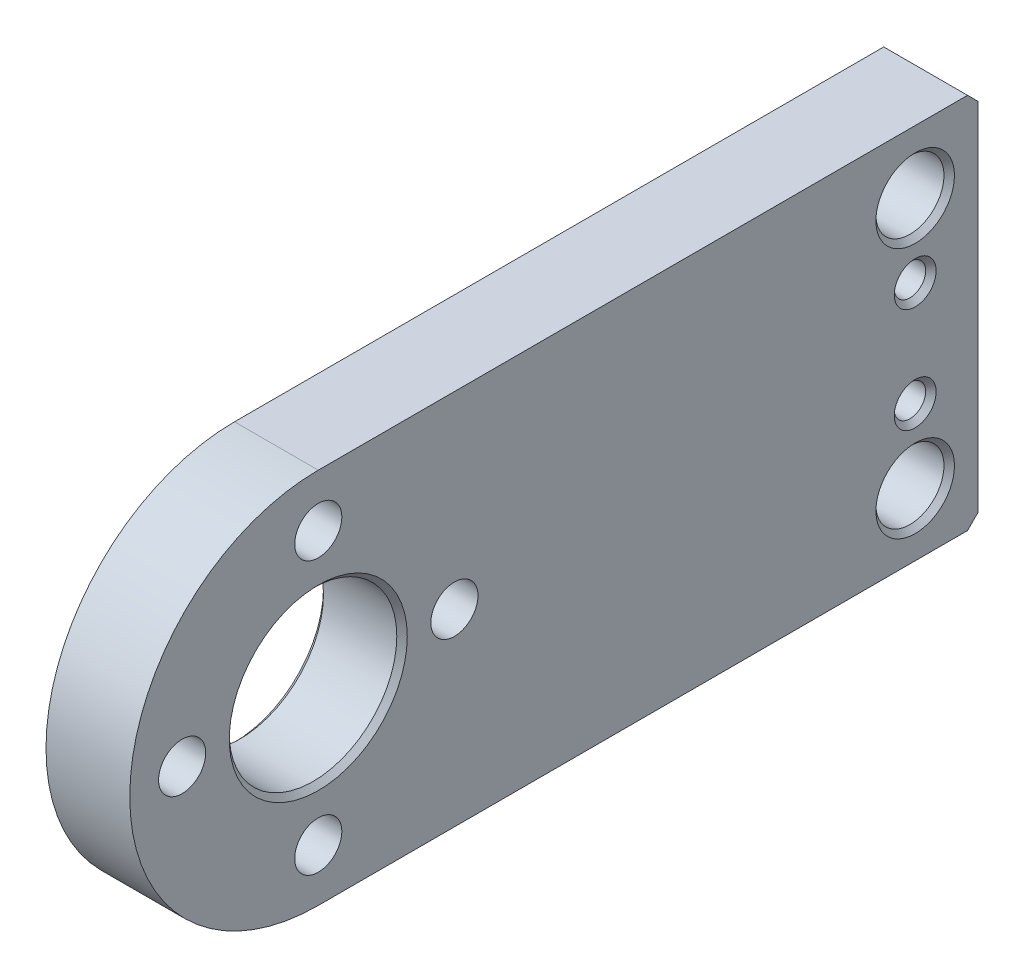
ISO-10303-21;
HEADER;
FILE_DESCRIPTION(('STEP AP214'),'2;1');
FILE_NAME('part.step','',(''),(''),'','','');
FILE_SCHEMA(('AUTOMOTIVE_DESIGN { 1 0 10303 214 1 1 1 1 }'));
ENDSEC;
DATA;
#1=APPLICATION_CONTEXT('core data for automotive mechanical design processes');
#2=APPLICATION_PROTOCOL_DEFINITION('international standard','automotive_design',2000,#1);
#3=PRODUCT_CONTEXT('',#1,'mechanical');
#4=PRODUCT('Part','Part','',(#3));
#5=PRODUCT_RELATED_PRODUCT_CATEGORY('part','',(#4));
#6=PRODUCT_DEFINITION_FORMATION('','',#4);
#7=PRODUCT_DEFINITION_CONTEXT('part definition',#1,'design');
#8=PRODUCT_DEFINITION('design','',#6,#7);
#9=PRODUCT_DEFINITION_SHAPE('','',#8);
#10=(LENGTH_UNIT() NAMED_UNIT(*) SI_UNIT(.MILLI.,.METRE.));
#11=(NAMED_UNIT(*) PLANE_ANGLE_UNIT() SI_UNIT($,.RADIAN.));
#12=(NAMED_UNIT(*) SI_UNIT($,.STERADIAN.) SOLID_ANGLE_UNIT());
#13=UNCERTAINTY_MEASURE_WITH_UNIT(LENGTH_MEASURE(1.E-05),#10,'distance_accuracy_value','');
#14=(GEOMETRIC_REPRESENTATION_CONTEXT(3) GLOBAL_UNCERTAINTY_ASSIGNED_CONTEXT((#13)) GLOBAL_UNIT_ASSIGNED_CONTEXT((#10,
#11,#12)) REPRESENTATION_CONTEXT('',''));
#15=CARTESIAN_POINT('',(0.,0.,0.));
#16=DIRECTION('',(0.,0.,1.));
#17=DIRECTION('',(1.,0.,0.));
#18=AXIS2_PLACEMENT_3D('',#15,#16,#17);
#19=CARTESIAN_POINT('',(8.,2.38596491228071,31.4385964912281));
#20=DIRECTION('',(1.,0.,0.));
#21=DIRECTION('',(0.,0.,-1.));
#22=AXIS2_PLACEMENT_3D('',#19,#20,#21);
#23=PLANE('',#22);
#24=CARTESIAN_POINT('',(8.,-9.61403508771929,-25.5614035087719));
#25=DIRECTION('',(1.,0.,0.));
#26=DIRECTION('',(0.,0.,-1.));
#27=AXIS2_PLACEMENT_3D('',#24,#25,#26);
#28=CIRCLE('',#27,3.75);
#29=CARTESIAN_POINT('',(8.,-9.61403508771929,-29.3114035087719));
#30=VERTEX_POINT('',#29);
#31=EDGE_CURVE('E164',#30,#30,#28,.F.);
#32=ORIENTED_EDGE('',*,*,#31,.T.);
#33=EDGE_LOOP('',(#32));
#34=FACE_BOUND('',#33,.T.);
#35=CARTESIAN_POINT('',(8.,-2.61403508771929,-25.5614035087719));
#36=DIRECTION('',(1.,0.,0.));
#37=DIRECTION('',(0.,0.,-1.));
#38=AXIS2_PLACEMENT_3D('',#35,#36,#37);
#39=CIRCLE('',#38,1.99999999999997);
#40=CARTESIAN_POINT('',(8.,-2.61403508771929,-27.5614035087719));
#41=VERTEX_POINT('',#40);
#42=EDGE_CURVE('E161',#41,#41,#39,.F.);
#43=ORIENTED_EDGE('',*,*,#42,.T.);
#44=EDGE_LOOP('',(#43));
#45=FACE_BOUND('',#44,.T.);
#46=CARTESIAN_POINT('',(8.,7.38596491228071,-25.5614035087719));
#47=DIRECTION('',(1.,0.,0.));
#48=DIRECTION('',(0.,0.,-1.));
#49=AXIS2_PLACEMENT_3D('',#46,#47,#48);
#50=CIRCLE('',#49,1.99999999999997);
#51=CARTESIAN_POINT('',(8.,7.38596491228071,-27.5614035087719));
#52=VERTEX_POINT('',#51);
#53=EDGE_CURVE('E158',#52,#52,#50,.F.);
#54=ORIENTED_EDGE('',*,*,#53,.T.);
#55=EDGE_LOOP('',(#54));
#56=FACE_BOUND('',#55,.T.);
#57=CARTESIAN_POINT('',(8.,14.3859649122807,-25.5614035087719));
#58=DIRECTION('',(1.,0.,0.));
#59=DIRECTION('',(0.,0.,-1.));
#60=AXIS2_PLACEMENT_3D('',#57,#58,#59);
#61=CIRCLE('',#60,3.75);
#62=CARTESIAN_POINT('',(8.,14.3859649122807,-29.3114035087719));
#63=VERTEX_POINT('',#62);
#64=EDGE_CURVE('E155',#63,#63,#61,.F.);
#65=ORIENTED_EDGE('',*,*,#64,.T.);
#66=EDGE_LOOP('',(#65));
#67=FACE_BOUND('',#66,.T.);
#68=CARTESIAN_POINT('',(8.,2.38596491228071,31.4385964912281));
#69=DIRECTION('',(1.,0.,0.));
#70=DIRECTION('',(0.,0.,-1.));
#71=AXIS2_PLACEMENT_3D('',#68,#69,#70);
#72=CIRCLE('',#71,8.49999999999998);
#73=CARTESIAN_POINT('',(8.,2.38596491228071,22.9385964912281));
#74=VERTEX_POINT('',#73);
#75=EDGE_CURVE('E152',#74,#74,#72,.F.);
#76=ORIENTED_EDGE('',*,*,#75,.T.);
#77=EDGE_LOOP('',(#76));
#78=FACE_BOUND('',#77,.T.);
#79=CARTESIAN_POINT('',(8.,-10.6140350877193,31.4385964912281));
#80=DIRECTION('',(1.,0.,0.));
#81=DIRECTION('',(0.,0.,-1.));
#82=AXIS2_PLACEMENT_3D('',#79,#80,#81);
#83=CIRCLE('',#82,2.25);
#84=CARTESIAN_POINT('',(8.,-10.6140350877193,29.1885964912281));
#85=VERTEX_POINT('',#84);
#86=EDGE_CURVE('E381',#85,#85,#83,.T.);
#87=ORIENTED_EDGE('',*,*,#86,.F.);
#88=EDGE_LOOP('',(#87));
#89=FACE_BOUND('',#88,.T.);
#90=CARTESIAN_POINT('',(8.,15.3859649122807,31.4385964912281));
#91=DIRECTION('',(1.,0.,0.));
#92=DIRECTION('',(0.,0.,-1.));
#93=AXIS2_PLACEMENT_3D('',#90,#91,#92);
#94=CIRCLE('',#93,2.25);
#95=CARTESIAN_POINT('',(8.,15.3859649122807,29.1885964912281));
#96=VERTEX_POINT('',#95);
#97=EDGE_CURVE('E337',#96,#96,#94,.T.);
#98=ORIENTED_EDGE('',*,*,#97,.F.);
#99=EDGE_LOOP('',(#98));
#100=FACE_BOUND('',#99,.T.);
#101=DIRECTION('',(0.,0.,-1.));
#102=VECTOR('',#101,1.);
#103=CARTESIAN_POINT('',(8.,-15.6140350877193,31.4385964912281));
#104=LINE('',#103,#102);
#105=CARTESIAN_POINT('',(8.,-15.6140350877193,31.4385964912281));
#106=VERTEX_POINT('',#105);
#107=CARTESIAN_POINT('',(8.,-15.6140350877193,-30.5614035087719));
#108=VERTEX_POINT('',#107);
#109=EDGE_CURVE('E89',#106,#108,#104,.T.);
#110=ORIENTED_EDGE('',*,*,#109,.T.);
#111=DIRECTION('',(0.,-0.707106781186548,0.707106781186548));
#112=VECTOR('',#111,1.);
#113=CARTESIAN_POINT('',(8.,-37.6140350877193,-8.56140350877193));
#114=LINE('',#113,#112);
#115=CARTESIAN_POINT('',(8.,-14.6140350877193,-31.5614035087719));
#116=VERTEX_POINT('',#115);
#117=EDGE_CURVE('E126',#108,#116,#114,.F.);
#118=ORIENTED_EDGE('',*,*,#117,.T.);
#119=DIRECTION('',(0.,1.,0.));
#120=VECTOR('',#119,1.);
#121=CARTESIAN_POINT('',(8.,20.3859649122807,-31.5614035087719));
#122=LINE('',#121,#120);
#123=CARTESIAN_POINT('',(8.,19.3859649122807,-31.5614035087719));
#124=VERTEX_POINT('',#123);
#125=EDGE_CURVE('E96',#116,#124,#122,.T.);
#126=ORIENTED_EDGE('',*,*,#125,.T.);
#127=DIRECTION('',(0.,-0.707106781186552,-0.707106781186543));
#128=VECTOR('',#127,1.);
#129=CARTESIAN_POINT('',(8.,42.3859649122806,-8.56140350877236));
#130=LINE('',#129,#128);
#131=CARTESIAN_POINT('',(8.,20.3859649122807,-30.5614035087719));
#132=VERTEX_POINT('',#131);
#133=EDGE_CURVE('E51',#124,#132,#130,.F.);
#134=ORIENTED_EDGE('',*,*,#133,.T.);
#135=DIRECTION('',(0.,0.,1.));
#136=VECTOR('',#135,1.);
#137=CARTESIAN_POINT('',(8.,20.3859649122807,31.4385964912281));
#138=LINE('',#137,#136);
#139=CARTESIAN_POINT('',(8.,20.3859649122807,31.4385964912281));
#140=VERTEX_POINT('',#139);
#141=EDGE_CURVE('E101',#132,#140,#138,.T.);
#142=ORIENTED_EDGE('',*,*,#141,.T.);
#143=CARTESIAN_POINT('',(8.,2.38596491228071,31.4385964912281));
#144=DIRECTION('',(1.,0.,0.));
#145=DIRECTION('',(0.,0.,-1.));
#146=AXIS2_PLACEMENT_3D('',#143,#144,#145);
#147=CIRCLE('',#146,18.);
#148=EDGE_CURVE('E97',#140,#106,#147,.T.);
#149=ORIENTED_EDGE('',*,*,#148,.T.);
#150=EDGE_LOOP('',(#110,#118,#126,#134,#142,#149));
#151=FACE_BOUND('',#150,.T.);
#152=CARTESIAN_POINT('',(8.,2.38596491228071,18.4385964912281));
#153=DIRECTION('',(1.,0.,0.));
#154=DIRECTION('',(0.,0.,-1.));
#155=AXIS2_PLACEMENT_3D('',#152,#153,#154);
#156=CIRCLE('',#155,2.25);
#157=CARTESIAN_POINT('',(8.,2.38596491228071,16.1885964912281));
#158=VERTEX_POINT('',#157);
#159=EDGE_CURVE('E342',#158,#158,#156,.T.);
#160=ORIENTED_EDGE('',*,*,#159,.F.);
#161=EDGE_LOOP('',(#160));
#162=FACE_BOUND('',#161,.T.);
#163=CARTESIAN_POINT('',(8.,2.38596491228071,44.4385964912281));
#164=DIRECTION('',(1.,0.,0.));
#165=DIRECTION('',(0.,0.,-1.));
#166=AXIS2_PLACEMENT_3D('',#163,#164,#165);
#167=CIRCLE('',#166,2.25);
#168=CARTESIAN_POINT('',(8.,2.38596491228071,42.1885964912281));
#169=VERTEX_POINT('',#168);
#170=EDGE_CURVE('E376',#169,#169,#167,.T.);
#171=ORIENTED_EDGE('',*,*,#170,.F.);
#172=EDGE_LOOP('',(#171));
#173=FACE_BOUND('',#172,.T.);
#174=ADVANCED_FACE('F35',(#34,#45,#56,#67,#78,#89,#100,#151,#162,#173),#23,.T.);
#175=CARTESIAN_POINT('',(0.,2.38596491228071,31.4385964912281));
#176=DIRECTION('',(1.,0.,0.));
#177=DIRECTION('',(0.,0.,-1.));
#178=AXIS2_PLACEMENT_3D('',#175,#176,#177);
#179=PLANE('',#178);
#180=CARTESIAN_POINT('',(0.,-9.61403508771929,-25.5614035087719));
#181=DIRECTION('',(1.,0.,0.));
#182=DIRECTION('',(0.,0.,-1.));
#183=AXIS2_PLACEMENT_3D('',#180,#181,#182);
#184=CIRCLE('',#183,3.75000000000001);
#185=CARTESIAN_POINT('',(0.,-9.61403508771929,-29.3114035087719));
#186=VERTEX_POINT('',#185);
#187=EDGE_CURVE('E143',#186,#186,#184,.T.);
#188=ORIENTED_EDGE('',*,*,#187,.T.);
#189=EDGE_LOOP('',(#188));
#190=FACE_BOUND('',#189,.T.);
#191=CARTESIAN_POINT('',(0.,-2.61403508771929,-25.5614035087719));
#192=DIRECTION('',(1.,0.,0.));
#193=DIRECTION('',(0.,0.,-1.));
#194=AXIS2_PLACEMENT_3D('',#191,#192,#193);
#195=CIRCLE('',#194,1.99999999999999);
#196=CARTESIAN_POINT('',(0.,-2.61403508771929,-27.5614035087719));
#197=VERTEX_POINT('',#196);
#198=EDGE_CURVE('E140',#197,#197,#195,.T.);
#199=ORIENTED_EDGE('',*,*,#198,.T.);
#200=EDGE_LOOP('',(#199));
#201=FACE_BOUND('',#200,.T.);
#202=CARTESIAN_POINT('',(0.,7.38596491228071,-25.5614035087719));
#203=DIRECTION('',(1.,0.,0.));
#204=DIRECTION('',(0.,0.,-1.));
#205=AXIS2_PLACEMENT_3D('',#202,#203,#204);
#206=CIRCLE('',#205,1.99999999999999);
#207=CARTESIAN_POINT('',(0.,7.38596491228071,-27.5614035087719));
#208=VERTEX_POINT('',#207);
#209=EDGE_CURVE('E137',#208,#208,#206,.T.);
#210=ORIENTED_EDGE('',*,*,#209,.T.);
#211=EDGE_LOOP('',(#210));
#212=FACE_BOUND('',#211,.T.);
#213=CARTESIAN_POINT('',(0.,14.3859649122807,-25.5614035087719));
#214=DIRECTION('',(1.,0.,0.));
#215=DIRECTION('',(0.,0.,-1.));
#216=AXIS2_PLACEMENT_3D('',#213,#214,#215);
#217=CIRCLE('',#216,3.75000000000001);
#218=CARTESIAN_POINT('',(0.,14.3859649122807,-29.3114035087719));
#219=VERTEX_POINT('',#218);
#220=EDGE_CURVE('E134',#219,#219,#217,.T.);
#221=ORIENTED_EDGE('',*,*,#220,.T.);
#222=EDGE_LOOP('',(#221));
#223=FACE_BOUND('',#222,.T.);
#224=CARTESIAN_POINT('',(0.,2.38596491228071,31.4385964912281));
#225=DIRECTION('',(1.,0.,0.));
#226=DIRECTION('',(0.,0.,-1.));
#227=AXIS2_PLACEMENT_3D('',#224,#225,#226);
#228=CIRCLE('',#227,8.50000000000001);
#229=CARTESIAN_POINT('',(0.,2.38596491228071,22.9385964912281));
#230=VERTEX_POINT('',#229);
#231=EDGE_CURVE('E131',#230,#230,#228,.T.);
#232=ORIENTED_EDGE('',*,*,#231,.T.);
#233=EDGE_LOOP('',(#232));
#234=FACE_BOUND('',#233,.T.);
#235=DIRECTION('',(0.,1.,0.));
#236=VECTOR('',#235,1.);
#237=CARTESIAN_POINT('',(0.,20.3859649122807,-31.5614035087719));
#238=LINE('',#237,#236);
#239=CARTESIAN_POINT('',(0.,-14.6140350877193,-31.5614035087719));
#240=VERTEX_POINT('',#239);
#241=CARTESIAN_POINT('',(0.,19.3859649122807,-31.5614035087719));
#242=VERTEX_POINT('',#241);
#243=EDGE_CURVE('E355',#240,#242,#238,.T.);
#244=ORIENTED_EDGE('',*,*,#243,.F.);
#245=DIRECTION('',(0.,0.707106781186548,-0.707106781186548));
#246=VECTOR('',#245,1.);
#247=CARTESIAN_POINT('',(0.,-14.6140350877193,-31.5614035087719));
#248=LINE('',#247,#246);
#249=CARTESIAN_POINT('',(0.,-15.6140350877193,-30.5614035087719));
#250=VERTEX_POINT('',#249);
#251=EDGE_CURVE('E122',#240,#250,#248,.F.);
#252=ORIENTED_EDGE('',*,*,#251,.T.);
#253=DIRECTION('',(0.,0.,-1.));
#254=VECTOR('',#253,1.);
#255=CARTESIAN_POINT('',(0.,-15.6140350877193,31.4385964912281));
#256=LINE('',#255,#254);
#257=CARTESIAN_POINT('',(0.,-15.6140350877193,31.4385964912281));
#258=VERTEX_POINT('',#257);
#259=EDGE_CURVE('E353',#258,#250,#256,.T.);
#260=ORIENTED_EDGE('',*,*,#259,.F.);
#261=CARTESIAN_POINT('',(0.,2.38596491228071,31.4385964912281));
#262=DIRECTION('',(1.,0.,0.));
#263=DIRECTION('',(0.,0.,-1.));
#264=AXIS2_PLACEMENT_3D('',#261,#262,#263);
#265=CIRCLE('',#264,18.);
#266=CARTESIAN_POINT('',(0.,20.3859649122807,31.4385964912281));
#267=VERTEX_POINT('',#266);
#268=EDGE_CURVE('E109',#267,#258,#265,.T.);
#269=ORIENTED_EDGE('',*,*,#268,.F.);
#270=DIRECTION('',(0.,0.,1.));
#271=VECTOR('',#270,1.);
#272=CARTESIAN_POINT('',(0.,20.3859649122807,31.4385964912281));
#273=LINE('',#272,#271);
#274=CARTESIAN_POINT('',(0.,20.3859649122807,-30.5614035087719));
#275=VERTEX_POINT('',#274);
#276=EDGE_CURVE('E105',#275,#267,#273,.T.);
#277=ORIENTED_EDGE('',*,*,#276,.F.);
#278=DIRECTION('',(0.,0.707106781186552,0.707106781186543));
#279=VECTOR('',#278,1.);
#280=CARTESIAN_POINT('',(0.,20.3859649122807,-30.5614035087719));
#281=LINE('',#280,#279);
#282=EDGE_CURVE('E120',#275,#242,#281,.F.);
#283=ORIENTED_EDGE('',*,*,#282,.T.);
#284=EDGE_LOOP('',(#244,#252,#260,#269,#277,#283));
#285=FACE_BOUND('',#284,.T.);
#286=CARTESIAN_POINT('',(0.,15.3859649122807,31.4385964912281));
#287=DIRECTION('',(1.,0.,0.));
#288=DIRECTION('',(0.,0.,-1.));
#289=AXIS2_PLACEMENT_3D('',#286,#287,#288);
#290=CIRCLE('',#289,2.25);
#291=CARTESIAN_POINT('',(0.,15.3859649122807,29.1885964912281));
#292=VERTEX_POINT('',#291);
#293=EDGE_CURVE('E340',#292,#292,#290,.T.);
#294=ORIENTED_EDGE('',*,*,#293,.T.);
#295=EDGE_LOOP('',(#294));
#296=FACE_BOUND('',#295,.T.);
#297=CARTESIAN_POINT('',(0.,2.38596491228071,18.4385964912281));
#298=DIRECTION('',(1.,0.,0.));
#299=DIRECTION('',(0.,0.,-1.));
#300=AXIS2_PLACEMENT_3D('',#297,#298,#299);
#301=CIRCLE('',#300,2.25);
#302=CARTESIAN_POINT('',(0.,2.38596491228071,16.1885964912281));
#303=VERTEX_POINT('',#302);
#304=EDGE_CURVE('E346',#303,#303,#301,.T.);
#305=ORIENTED_EDGE('',*,*,#304,.T.);
#306=EDGE_LOOP('',(#305));
#307=FACE_BOUND('',#306,.T.);
#308=CARTESIAN_POINT('',(0.,-10.6140350877193,31.4385964912281));
#309=DIRECTION('',(1.,0.,0.));
#310=DIRECTION('',(0.,0.,-1.));
#311=AXIS2_PLACEMENT_3D('',#308,#309,#310);
#312=CIRCLE('',#311,2.25);
#313=CARTESIAN_POINT('',(0.,-10.6140350877193,29.1885964912281));
#314=VERTEX_POINT('',#313);
#315=EDGE_CURVE('E371',#314,#314,#312,.T.);
#316=ORIENTED_EDGE('',*,*,#315,.T.);
#317=EDGE_LOOP('',(#316));
#318=FACE_BOUND('',#317,.T.);
#319=CARTESIAN_POINT('',(0.,2.38596491228071,44.4385964912281));
#320=DIRECTION('',(1.,0.,0.));
#321=DIRECTION('',(0.,0.,-1.));
#322=AXIS2_PLACEMENT_3D('',#319,#320,#321);
#323=CIRCLE('',#322,2.25);
#324=CARTESIAN_POINT('',(0.,2.38596491228071,42.1885964912281));
#325=VERTEX_POINT('',#324);
#326=EDGE_CURVE('E374',#325,#325,#323,.T.);
#327=ORIENTED_EDGE('',*,*,#326,.T.);
#328=EDGE_LOOP('',(#327));
#329=FACE_BOUND('',#328,.T.);
#330=ADVANCED_FACE('F199',(#190,#201,#212,#223,#234,#285,#296,#307,#318,#329),#179,.F.);
#331=CARTESIAN_POINT('',(8.,2.38596491228071,31.4385964912281));
#332=DIRECTION('',(-1.,0.,0.));
#333=DIRECTION('',(0.,0.,1.));
#334=AXIS2_PLACEMENT_3D('',#331,#332,#333);
#335=CYLINDRICAL_SURFACE('',#334,18.);
#336=ORIENTED_EDGE('',*,*,#268,.T.);
#337=DIRECTION('',(-1.,0.,0.));
#338=VECTOR('',#337,1.);
#339=CARTESIAN_POINT('',(8.,-15.6140350877193,31.4385964912281));
#340=LINE('',#339,#338);
#341=EDGE_CURVE('E93',#106,#258,#340,.T.);
#342=ORIENTED_EDGE('',*,*,#341,.F.);
#343=ORIENTED_EDGE('',*,*,#148,.F.);
#344=DIRECTION('',(-1.,0.,0.));
#345=VECTOR('',#344,1.);
#346=CARTESIAN_POINT('',(8.,20.3859649122807,31.4385964912281));
#347=LINE('',#346,#345);
#348=EDGE_CURVE('E111',#140,#267,#347,.T.);
#349=ORIENTED_EDGE('',*,*,#348,.T.);
#350=EDGE_LOOP('',(#336,#342,#343,#349));
#351=FACE_BOUND('',#350,.T.);
#352=ADVANCED_FACE('F107',(#351),#335,.T.);
#353=CARTESIAN_POINT('',(8.,-15.6140350877193,31.4385964912281));
#354=DIRECTION('',(0.,1.,0.));
#355=DIRECTION('',(0.,0.,1.));
#356=AXIS2_PLACEMENT_3D('',#353,#354,#355);
#357=PLANE('',#356);
#358=ORIENTED_EDGE('',*,*,#259,.T.);
#359=DIRECTION('',(1.,0.,0.));
#360=VECTOR('',#359,1.);
#361=CARTESIAN_POINT('',(8.,-15.6140350877193,-30.5614035087719));
#362=LINE('',#361,#360);
#363=EDGE_CURVE('E59',#250,#108,#362,.T.);
#364=ORIENTED_EDGE('',*,*,#363,.T.);
#365=ORIENTED_EDGE('',*,*,#109,.F.);
#366=ORIENTED_EDGE('',*,*,#341,.T.);
#367=EDGE_LOOP('',(#358,#364,#365,#366));
#368=FACE_BOUND('',#367,.T.);
#369=ADVANCED_FACE('F91',(#368),#357,.F.);
#370=CARTESIAN_POINT('',(8.,20.3859649122807,-31.5614035087719));
#371=DIRECTION('',(0.,0.,1.));
#372=DIRECTION('',(1.,0.,0.));
#373=AXIS2_PLACEMENT_3D('',#370,#371,#372);
#374=PLANE('',#373);
#375=ORIENTED_EDGE('',*,*,#125,.F.);
#376=DIRECTION('',(-1.,0.,0.));
#377=VECTOR('',#376,1.);
#378=CARTESIAN_POINT('',(8.,-14.6140350877193,-31.5614035087719));
#379=LINE('',#378,#377);
#380=EDGE_CURVE('E113',#116,#240,#379,.T.);
#381=ORIENTED_EDGE('',*,*,#380,.T.);
#382=ORIENTED_EDGE('',*,*,#243,.T.);
#383=DIRECTION('',(1.,0.,0.));
#384=VECTOR('',#383,1.);
#385=CARTESIAN_POINT('',(8.,19.3859649122807,-31.5614035087719));
#386=LINE('',#385,#384);
#387=EDGE_CURVE('E110',#242,#124,#386,.T.);
#388=ORIENTED_EDGE('',*,*,#387,.T.);
#389=EDGE_LOOP('',(#375,#381,#382,#388));
#390=FACE_BOUND('',#389,.T.);
#391=ADVANCED_FACE('F214',(#390),#374,.F.);
#392=CARTESIAN_POINT('',(8.,20.3859649122807,31.4385964912281));
#393=DIRECTION('',(0.,-1.,0.));
#394=DIRECTION('',(0.,0.,-1.));
#395=AXIS2_PLACEMENT_3D('',#392,#393,#394);
#396=PLANE('',#395);
#397=ORIENTED_EDGE('',*,*,#141,.F.);
#398=DIRECTION('',(-1.,0.,0.));
#399=VECTOR('',#398,1.);
#400=CARTESIAN_POINT('',(8.,20.3859649122807,-30.5614035087719));
#401=LINE('',#400,#399);
#402=EDGE_CURVE('E128',#132,#275,#401,.T.);
#403=ORIENTED_EDGE('',*,*,#402,.T.);
#404=ORIENTED_EDGE('',*,*,#276,.T.);
#405=ORIENTED_EDGE('',*,*,#348,.F.);
#406=EDGE_LOOP('',(#397,#403,#404,#405));
#407=FACE_BOUND('',#406,.T.);
#408=ADVANCED_FACE('F211',(#407),#396,.F.);
#409=CARTESIAN_POINT('',(8.,2.38596491228071,31.4385964912281));
#410=DIRECTION('',(-1.,0.,0.));
#411=DIRECTION('',(0.,0.,1.));
#412=AXIS2_PLACEMENT_3D('',#409,#410,#411);
#413=CYLINDRICAL_SURFACE('',#412,8.);
#414=CARTESIAN_POINT('',(0.500000000000013,2.38596491228071,31.4385964912281));
#415=DIRECTION('',(1.,0.,0.));
#416=DIRECTION('',(0.,0.,-1.));
#417=AXIS2_PLACEMENT_3D('',#414,#415,#416);
#418=CIRCLE('',#417,8.);
#419=CARTESIAN_POINT('',(0.500000000000013,2.38596491228071,23.4385964912281));
#420=VERTEX_POINT('',#419);
#421=EDGE_CURVE('E11',#420,#420,#418,.F.);
#422=ORIENTED_EDGE('',*,*,#421,.T.);
#423=EDGE_LOOP('',(#422));
#424=FACE_BOUND('',#423,.T.);
#425=CARTESIAN_POINT('',(7.50000000000001,2.38596491228071,31.4385964912281));
#426=DIRECTION('',(1.,0.,0.));
#427=DIRECTION('',(0.,0.,-1.));
#428=AXIS2_PLACEMENT_3D('',#425,#426,#427);
#429=CIRCLE('',#428,8.);
#430=CARTESIAN_POINT('',(7.50000000000001,2.38596491228071,23.4385964912281));
#431=VERTEX_POINT('',#430);
#432=EDGE_CURVE('E44',#431,#431,#429,.T.);
#433=ORIENTED_EDGE('',*,*,#432,.T.);
#434=EDGE_LOOP('',(#433));
#435=FACE_BOUND('',#434,.T.);
#436=ADVANCED_FACE('F187',(#424,#435),#413,.F.);
#437=CARTESIAN_POINT('',(8.,15.3859649122807,31.4385964912281));
#438=DIRECTION('',(-1.,0.,0.));
#439=DIRECTION('',(0.,0.,1.));
#440=AXIS2_PLACEMENT_3D('',#437,#438,#439);
#441=CYLINDRICAL_SURFACE('',#440,2.25);
#442=ORIENTED_EDGE('',*,*,#97,.T.);
#443=EDGE_LOOP('',(#442));
#444=FACE_BOUND('',#443,.T.);
#445=ORIENTED_EDGE('',*,*,#293,.F.);
#446=EDGE_LOOP('',(#445));
#447=FACE_BOUND('',#446,.T.);
#448=ADVANCED_FACE('F326',(#444,#447),#441,.F.);
#449=CARTESIAN_POINT('',(8.,2.38596491228071,18.4385964912281));
#450=DIRECTION('',(-1.,0.,0.));
#451=DIRECTION('',(0.,0.,1.));
#452=AXIS2_PLACEMENT_3D('',#449,#450,#451);
#453=CYLINDRICAL_SURFACE('',#452,2.25);
#454=ORIENTED_EDGE('',*,*,#159,.T.);
#455=EDGE_LOOP('',(#454));
#456=FACE_BOUND('',#455,.T.);
#457=ORIENTED_EDGE('',*,*,#304,.F.);
#458=EDGE_LOOP('',(#457));
#459=FACE_BOUND('',#458,.T.);
#460=ADVANCED_FACE('F323',(#456,#459),#453,.F.);
#461=CARTESIAN_POINT('',(8.,-10.6140350877193,31.4385964912281));
#462=DIRECTION('',(-1.,0.,0.));
#463=DIRECTION('',(0.,0.,1.));
#464=AXIS2_PLACEMENT_3D('',#461,#462,#463);
#465=CYLINDRICAL_SURFACE('',#464,2.25);
#466=ORIENTED_EDGE('',*,*,#86,.T.);
#467=EDGE_LOOP('',(#466));
#468=FACE_BOUND('',#467,.T.);
#469=ORIENTED_EDGE('',*,*,#315,.F.);
#470=EDGE_LOOP('',(#469));
#471=FACE_BOUND('',#470,.T.);
#472=ADVANCED_FACE('F316',(#468,#471),#465,.F.);
#473=CARTESIAN_POINT('',(8.,2.38596491228071,44.4385964912281));
#474=DIRECTION('',(-1.,0.,0.));
#475=DIRECTION('',(0.,0.,1.));
#476=AXIS2_PLACEMENT_3D('',#473,#474,#475);
#477=CYLINDRICAL_SURFACE('',#476,2.25);
#478=ORIENTED_EDGE('',*,*,#170,.T.);
#479=EDGE_LOOP('',(#478));
#480=FACE_BOUND('',#479,.T.);
#481=ORIENTED_EDGE('',*,*,#326,.F.);
#482=EDGE_LOOP('',(#481));
#483=FACE_BOUND('',#482,.T.);
#484=ADVANCED_FACE('F306',(#480,#483),#477,.F.);
#485=CARTESIAN_POINT('',(8.,14.3859649122807,-25.5614035087719));
#486=DIRECTION('',(-1.,0.,0.));
#487=DIRECTION('',(0.,0.,1.));
#488=AXIS2_PLACEMENT_3D('',#485,#486,#487);
#489=CYLINDRICAL_SURFACE('',#488,3.25);
#490=CARTESIAN_POINT('',(0.500000000000011,14.3859649122807,-25.5614035087719));
#491=DIRECTION('',(1.,0.,0.));
#492=DIRECTION('',(0.,0.,-1.));
#493=AXIS2_PLACEMENT_3D('',#490,#491,#492);
#494=CIRCLE('',#493,3.25);
#495=CARTESIAN_POINT('',(0.500000000000011,14.3859649122807,-28.8114035087719));
#496=VERTEX_POINT('',#495);
#497=EDGE_CURVE('E182',#496,#496,#494,.F.);
#498=ORIENTED_EDGE('',*,*,#497,.T.);
#499=EDGE_LOOP('',(#498));
#500=FACE_BOUND('',#499,.T.);
#501=CARTESIAN_POINT('',(7.5,14.3859649122807,-25.5614035087719));
#502=DIRECTION('',(1.,0.,0.));
#503=DIRECTION('',(0.,0.,-1.));
#504=AXIS2_PLACEMENT_3D('',#501,#502,#503);
#505=CIRCLE('',#504,3.25);
#506=CARTESIAN_POINT('',(7.5,14.3859649122807,-28.8114035087719));
#507=VERTEX_POINT('',#506);
#508=EDGE_CURVE('E179',#507,#507,#505,.T.);
#509=ORIENTED_EDGE('',*,*,#508,.T.);
#510=EDGE_LOOP('',(#509));
#511=FACE_BOUND('',#510,.T.);
#512=ADVANCED_FACE('F303',(#500,#511),#489,.F.);
#513=CARTESIAN_POINT('',(8.,7.38596491228071,-25.5614035087719));
#514=DIRECTION('',(-1.,0.,0.));
#515=DIRECTION('',(0.,0.,1.));
#516=AXIS2_PLACEMENT_3D('',#513,#514,#515);
#517=CYLINDRICAL_SURFACE('',#516,1.5);
#518=CARTESIAN_POINT('',(0.5,7.38596491228071,-25.5614035087719));
#519=DIRECTION('',(1.,0.,0.));
#520=DIRECTION('',(0.,0.,-1.));
#521=AXIS2_PLACEMENT_3D('',#518,#519,#520);
#522=CIRCLE('',#521,1.5);
#523=CARTESIAN_POINT('',(0.5,7.38596491228071,-27.0614035087719));
#524=VERTEX_POINT('',#523);
#525=EDGE_CURVE('E176',#524,#524,#522,.F.);
#526=ORIENTED_EDGE('',*,*,#525,.T.);
#527=EDGE_LOOP('',(#526));
#528=FACE_BOUND('',#527,.T.);
#529=CARTESIAN_POINT('',(7.50000000000002,7.38596491228071,-25.5614035087719));
#530=DIRECTION('',(1.,0.,0.));
#531=DIRECTION('',(0.,0.,-1.));
#532=AXIS2_PLACEMENT_3D('',#529,#530,#531);
#533=CIRCLE('',#532,1.5);
#534=CARTESIAN_POINT('',(7.50000000000002,7.38596491228071,-27.0614035087719));
#535=VERTEX_POINT('',#534);
#536=EDGE_CURVE('E173',#535,#535,#533,.T.);
#537=ORIENTED_EDGE('',*,*,#536,.T.);
#538=EDGE_LOOP('',(#537));
#539=FACE_BOUND('',#538,.T.);
#540=ADVANCED_FACE('F305',(#528,#539),#517,.F.);
#541=CARTESIAN_POINT('',(8.,-2.61403508771929,-25.5614035087719));
#542=DIRECTION('',(-1.,0.,0.));
#543=DIRECTION('',(0.,0.,1.));
#544=AXIS2_PLACEMENT_3D('',#541,#542,#543);
#545=CYLINDRICAL_SURFACE('',#544,1.5);
#546=CARTESIAN_POINT('',(0.5,-2.61403508771929,-25.5614035087719));
#547=DIRECTION('',(1.,0.,0.));
#548=DIRECTION('',(0.,0.,-1.));
#549=AXIS2_PLACEMENT_3D('',#546,#547,#548);
#550=CIRCLE('',#549,1.5);
#551=CARTESIAN_POINT('',(0.5,-2.61403508771929,-27.0614035087719));
#552=VERTEX_POINT('',#551);
#553=EDGE_CURVE('E170',#552,#552,#550,.F.);
#554=ORIENTED_EDGE('',*,*,#553,.T.);
#555=EDGE_LOOP('',(#554));
#556=FACE_BOUND('',#555,.T.);
#557=CARTESIAN_POINT('',(7.50000000000002,-2.61403508771929,-25.5614035087719));
#558=DIRECTION('',(1.,0.,0.));
#559=DIRECTION('',(0.,0.,-1.));
#560=AXIS2_PLACEMENT_3D('',#557,#558,#559);
#561=CIRCLE('',#560,1.5);
#562=CARTESIAN_POINT('',(7.50000000000002,-2.61403508771929,-27.0614035087719));
#563=VERTEX_POINT('',#562);
#564=EDGE_CURVE('E167',#563,#563,#561,.T.);
#565=ORIENTED_EDGE('',*,*,#564,.T.);
#566=EDGE_LOOP('',(#565));
#567=FACE_BOUND('',#566,.T.);
#568=ADVANCED_FACE('F313',(#556,#567),#545,.F.);
#569=CARTESIAN_POINT('',(8.,-9.61403508771929,-25.5614035087719));
#570=DIRECTION('',(-1.,0.,0.));
#571=DIRECTION('',(0.,0.,1.));
#572=AXIS2_PLACEMENT_3D('',#569,#570,#571);
#573=CYLINDRICAL_SURFACE('',#572,3.25);
#574=CARTESIAN_POINT('',(0.500000000000011,-9.61403508771929,-25.5614035087719));
#575=DIRECTION('',(1.,0.,0.));
#576=DIRECTION('',(0.,0.,-1.));
#577=AXIS2_PLACEMENT_3D('',#574,#575,#576);
#578=CIRCLE('',#577,3.25);
#579=CARTESIAN_POINT('',(0.500000000000011,-9.61403508771929,-28.8114035087719));
#580=VERTEX_POINT('',#579);
#581=EDGE_CURVE('E149',#580,#580,#578,.F.);
#582=ORIENTED_EDGE('',*,*,#581,.T.);
#583=EDGE_LOOP('',(#582));
#584=FACE_BOUND('',#583,.T.);
#585=CARTESIAN_POINT('',(7.5,-9.61403508771929,-25.5614035087719));
#586=DIRECTION('',(1.,0.,0.));
#587=DIRECTION('',(0.,0.,-1.));
#588=AXIS2_PLACEMENT_3D('',#585,#586,#587);
#589=CIRCLE('',#588,3.25);
#590=CARTESIAN_POINT('',(7.5,-9.61403508771929,-28.8114035087719));
#591=VERTEX_POINT('',#590);
#592=EDGE_CURVE('E146',#591,#591,#589,.T.);
#593=ORIENTED_EDGE('',*,*,#592,.T.);
#594=EDGE_LOOP('',(#593));
#595=FACE_BOUND('',#594,.T.);
#596=ADVANCED_FACE('F231',(#584,#595),#573,.F.);
#597=CARTESIAN_POINT('',(8.,-14.6140350877193,-31.5614035087719));
#598=DIRECTION('',(0.,0.707106781186547,0.707106781186547));
#599=DIRECTION('',(-1.,0.,0.));
#600=AXIS2_PLACEMENT_3D('',#597,#598,#599);
#601=PLANE('',#600);
#602=ORIENTED_EDGE('',*,*,#117,.F.);
#603=ORIENTED_EDGE('',*,*,#363,.F.);
#604=ORIENTED_EDGE('',*,*,#251,.F.);
#605=ORIENTED_EDGE('',*,*,#380,.F.);
#606=EDGE_LOOP('',(#602,#603,#604,#605));
#607=FACE_BOUND('',#606,.T.);
#608=ADVANCED_FACE('F224',(#607),#601,.F.);
#609=CARTESIAN_POINT('',(8.,20.3859649122807,-30.5614035087719));
#610=DIRECTION('',(0.,-0.707106781186543,0.707106781186552));
#611=DIRECTION('',(-1.,0.,0.));
#612=AXIS2_PLACEMENT_3D('',#609,#610,#611);
#613=PLANE('',#612);
#614=ORIENTED_EDGE('',*,*,#133,.F.);
#615=ORIENTED_EDGE('',*,*,#387,.F.);
#616=ORIENTED_EDGE('',*,*,#282,.F.);
#617=ORIENTED_EDGE('',*,*,#402,.F.);
#618=EDGE_LOOP('',(#614,#615,#616,#617));
#619=FACE_BOUND('',#618,.T.);
#620=ADVANCED_FACE('F230',(#619),#613,.F.);
#621=CARTESIAN_POINT('',(0.,-9.61403508771929,-25.5614035087719));
#622=DIRECTION('',(-1.,0.,0.));
#623=DIRECTION('',(0.,0.,1.));
#624=AXIS2_PLACEMENT_3D('',#621,#622,#623);
#625=CONICAL_SURFACE('',#624,3.75000000000001,0.785398163397447);
#626=ORIENTED_EDGE('',*,*,#581,.F.);
#627=EDGE_LOOP('',(#626));
#628=FACE_BOUND('',#627,.T.);
#629=ORIENTED_EDGE('',*,*,#187,.F.);
#630=EDGE_LOOP('',(#629));
#631=FACE_BOUND('',#630,.T.);
#632=ADVANCED_FACE('F238',(#628,#631),#625,.F.);
#633=CARTESIAN_POINT('',(7.5,-9.61403508771929,-25.5614035087719));
#634=DIRECTION('',(1.,0.,0.));
#635=DIRECTION('',(0.,0.,-1.));
#636=AXIS2_PLACEMENT_3D('',#633,#634,#635);
#637=CONICAL_SURFACE('',#636,3.25,0.785398163397451);
#638=ORIENTED_EDGE('',*,*,#31,.F.);
#639=EDGE_LOOP('',(#638));
#640=FACE_BOUND('',#639,.T.);
#641=ORIENTED_EDGE('',*,*,#592,.F.);
#642=EDGE_LOOP('',(#641));
#643=FACE_BOUND('',#642,.T.);
#644=ADVANCED_FACE('F245',(#640,#643),#637,.F.);
#645=CARTESIAN_POINT('',(0.,-2.61403508771929,-25.5614035087719));
#646=DIRECTION('',(-1.,0.,0.));
#647=DIRECTION('',(0.,0.,1.));
#648=AXIS2_PLACEMENT_3D('',#645,#646,#647);
#649=CONICAL_SURFACE('',#648,1.99999999999999,0.785398163397443);
#650=ORIENTED_EDGE('',*,*,#553,.F.);
#651=EDGE_LOOP('',(#650));
#652=FACE_BOUND('',#651,.T.);
#653=ORIENTED_EDGE('',*,*,#198,.F.);
#654=EDGE_LOOP('',(#653));
#655=FACE_BOUND('',#654,.T.);
#656=ADVANCED_FACE('F252',(#652,#655),#649,.F.);
#657=CARTESIAN_POINT('',(7.50000000000002,-2.61403508771929,-25.5614035087719));
#658=DIRECTION('',(1.,0.,0.));
#659=DIRECTION('',(0.,0.,-1.));
#660=AXIS2_PLACEMENT_3D('',#657,#658,#659);
#661=CONICAL_SURFACE('',#660,1.5,0.785398163397443);
#662=ORIENTED_EDGE('',*,*,#42,.F.);
#663=EDGE_LOOP('',(#662));
#664=FACE_BOUND('',#663,.T.);
#665=ORIENTED_EDGE('',*,*,#564,.F.);
#666=EDGE_LOOP('',(#665));
#667=FACE_BOUND('',#666,.T.);
#668=ADVANCED_FACE('F259',(#664,#667),#661,.F.);
#669=CARTESIAN_POINT('',(0.,7.38596491228071,-25.5614035087719));
#670=DIRECTION('',(-1.,0.,0.));
#671=DIRECTION('',(0.,0.,1.));
#672=AXIS2_PLACEMENT_3D('',#669,#670,#671);
#673=CONICAL_SURFACE('',#672,1.99999999999999,0.785398163397443);
#674=ORIENTED_EDGE('',*,*,#525,.F.);
#675=EDGE_LOOP('',(#674));
#676=FACE_BOUND('',#675,.T.);
#677=ORIENTED_EDGE('',*,*,#209,.F.);
#678=EDGE_LOOP('',(#677));
#679=FACE_BOUND('',#678,.T.);
#680=ADVANCED_FACE('F266',(#676,#679),#673,.F.);
#681=CARTESIAN_POINT('',(7.50000000000002,7.38596491228071,-25.5614035087719));
#682=DIRECTION('',(1.,0.,0.));
#683=DIRECTION('',(0.,0.,-1.));
#684=AXIS2_PLACEMENT_3D('',#681,#682,#683);
#685=CONICAL_SURFACE('',#684,1.5,0.785398163397443);
#686=ORIENTED_EDGE('',*,*,#53,.F.);
#687=EDGE_LOOP('',(#686));
#688=FACE_BOUND('',#687,.T.);
#689=ORIENTED_EDGE('',*,*,#536,.F.);
#690=EDGE_LOOP('',(#689));
#691=FACE_BOUND('',#690,.T.);
#692=ADVANCED_FACE('F273',(#688,#691),#685,.F.);
#693=CARTESIAN_POINT('',(0.,14.3859649122807,-25.5614035087719));
#694=DIRECTION('',(-1.,0.,0.));
#695=DIRECTION('',(0.,0.,1.));
#696=AXIS2_PLACEMENT_3D('',#693,#694,#695);
#697=CONICAL_SURFACE('',#696,3.75000000000001,0.785398163397447);
#698=ORIENTED_EDGE('',*,*,#497,.F.);
#699=EDGE_LOOP('',(#698));
#700=FACE_BOUND('',#699,.T.);
#701=ORIENTED_EDGE('',*,*,#220,.F.);
#702=EDGE_LOOP('',(#701));
#703=FACE_BOUND('',#702,.T.);
#704=ADVANCED_FACE('F280',(#700,#703),#697,.F.);
#705=CARTESIAN_POINT('',(7.5,14.3859649122807,-25.5614035087719));
#706=DIRECTION('',(1.,0.,0.));
#707=DIRECTION('',(0.,0.,-1.));
#708=AXIS2_PLACEMENT_3D('',#705,#706,#707);
#709=CONICAL_SURFACE('',#708,3.25,0.785398163397451);
#710=ORIENTED_EDGE('',*,*,#64,.F.);
#711=EDGE_LOOP('',(#710));
#712=FACE_BOUND('',#711,.T.);
#713=ORIENTED_EDGE('',*,*,#508,.F.);
#714=EDGE_LOOP('',(#713));
#715=FACE_BOUND('',#714,.T.);
#716=ADVANCED_FACE('F195',(#712,#715),#709,.F.);
#717=CARTESIAN_POINT('',(0.,2.38596491228071,31.4385964912281));
#718=DIRECTION('',(-1.,0.,0.));
#719=DIRECTION('',(0.,0.,1.));
#720=AXIS2_PLACEMENT_3D('',#717,#718,#719);
#721=CONICAL_SURFACE('',#720,8.50000000000001,0.785398163397448);
#722=ORIENTED_EDGE('',*,*,#421,.F.);
#723=EDGE_LOOP('',(#722));
#724=FACE_BOUND('',#723,.T.);
#725=ORIENTED_EDGE('',*,*,#231,.F.);
#726=EDGE_LOOP('',(#725));
#727=FACE_BOUND('',#726,.T.);
#728=ADVANCED_FACE('F190',(#724,#727),#721,.F.);
#729=CARTESIAN_POINT('',(7.50000000000001,2.38596491228071,31.4385964912281));
#730=DIRECTION('',(1.,0.,0.));
#731=DIRECTION('',(0.,0.,-1.));
#732=AXIS2_PLACEMENT_3D('',#729,#730,#731);
#733=CONICAL_SURFACE('',#732,8.,0.785398163397434);
#734=ORIENTED_EDGE('',*,*,#75,.F.);
#735=EDGE_LOOP('',(#734));
#736=FACE_BOUND('',#735,.T.);
#737=ORIENTED_EDGE('',*,*,#432,.F.);
#738=EDGE_LOOP('',(#737));
#739=FACE_BOUND('',#738,.T.);
#740=ADVANCED_FACE('F38',(#736,#739),#733,.F.);
#741=CLOSED_SHELL('',(#174,#330,#352,#369,#391,#408,#436,#448,#460,#472,#484,#512,#540,#568,
#596,#608,#620,#632,#644,#656,#668,#680,#692,#704,#716,#728,#740));
#742=MANIFOLD_SOLID_BREP('B2',#741);
#743=ADVANCED_BREP_SHAPE_REPRESENTATION('',(#18,#742),#14);
#744=SHAPE_DEFINITION_REPRESENTATION(#9,#743);
ENDSEC;
END-ISO-10303-21;
